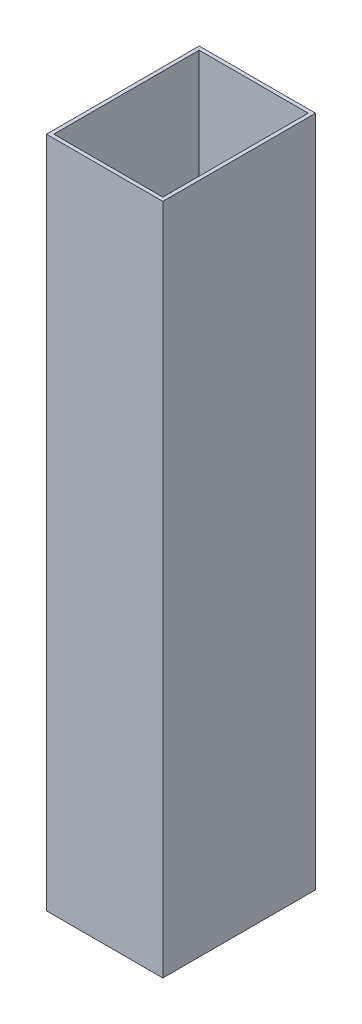
ISO-10303-21;
HEADER;
FILE_DESCRIPTION(('STEP AP214'),'2;1');
FILE_NAME('part.step','',(''),(''),'','','');
FILE_SCHEMA(('AUTOMOTIVE_DESIGN { 1 0 10303 214 1 1 1 1 }'));
ENDSEC;
DATA;
#1=APPLICATION_CONTEXT('core data for automotive mechanical design processes');
#2=APPLICATION_PROTOCOL_DEFINITION('international standard','automotive_design',2000,#1);
#3=PRODUCT_CONTEXT('',#1,'mechanical');
#4=PRODUCT('Part','Part','',(#3));
#5=PRODUCT_RELATED_PRODUCT_CATEGORY('part','',(#4));
#6=PRODUCT_DEFINITION_FORMATION('','',#4);
#7=PRODUCT_DEFINITION_CONTEXT('part definition',#1,'design');
#8=PRODUCT_DEFINITION('design','',#6,#7);
#9=PRODUCT_DEFINITION_SHAPE('','',#8);
#10=(LENGTH_UNIT() NAMED_UNIT(*) SI_UNIT(.MILLI.,.METRE.));
#11=(NAMED_UNIT(*) PLANE_ANGLE_UNIT() SI_UNIT($,.RADIAN.));
#12=(NAMED_UNIT(*) SI_UNIT($,.STERADIAN.) SOLID_ANGLE_UNIT());
#13=UNCERTAINTY_MEASURE_WITH_UNIT(LENGTH_MEASURE(1.E-05),#10,'distance_accuracy_value','');
#14=(GEOMETRIC_REPRESENTATION_CONTEXT(3) GLOBAL_UNCERTAINTY_ASSIGNED_CONTEXT((#13)) GLOBAL_UNIT_ASSIGNED_CONTEXT((#10,
#11,#12)) REPRESENTATION_CONTEXT('',''));
#15=CARTESIAN_POINT('',(0.,0.,0.));
#16=DIRECTION('',(0.,0.,1.));
#17=DIRECTION('',(1.,0.,0.));
#18=AXIS2_PLACEMENT_3D('',#15,#16,#17);
#19=CARTESIAN_POINT('',(0.,469.9,0.));
#20=DIRECTION('',(0.,1.,0.));
#21=DIRECTION('',(0.,0.,1.));
#22=AXIS2_PLACEMENT_3D('',#19,#20,#21);
#23=PLANE('',#22);
#24=DIRECTION('',(0.,0.,1.));
#25=VECTOR('',#24,1.);
#26=CARTESIAN_POINT('',(-29.9321568627451,469.9,18.9254901960784));
#27=LINE('',#26,#25);
#28=CARTESIAN_POINT('',(-29.9321568627451,469.9,16.3854901960784));
#29=VERTEX_POINT('',#28);
#30=CARTESIAN_POINT('',(-29.9321568627451,469.9,123.065490196078));
#31=VERTEX_POINT('',#30);
#32=EDGE_CURVE('E157',#29,#31,#27,.T.);
#33=ORIENTED_EDGE('',*,*,#32,.T.);
#34=DIRECTION('',(1.,0.,0.));
#35=VECTOR('',#34,1.);
#36=CARTESIAN_POINT('',(-27.3921568627451,469.9,123.065490196078));
#37=LINE('',#36,#35);
#38=CARTESIAN_POINT('',(51.3478431372549,469.9,123.065490196078));
#39=VERTEX_POINT('',#38);
#40=EDGE_CURVE('E160',#31,#39,#37,.T.);
#41=ORIENTED_EDGE('',*,*,#40,.T.);
#42=DIRECTION('',(0.,0.,-1.));
#43=VECTOR('',#42,1.);
#44=CARTESIAN_POINT('',(51.3478431372549,469.9,18.9254901960784));
#45=LINE('',#44,#43);
#46=CARTESIAN_POINT('',(51.3478431372549,469.9,16.3854901960784));
#47=VERTEX_POINT('',#46);
#48=EDGE_CURVE('E163',#39,#47,#45,.T.);
#49=ORIENTED_EDGE('',*,*,#48,.T.);
#50=DIRECTION('',(-1.,0.,0.));
#51=VECTOR('',#50,1.);
#52=CARTESIAN_POINT('',(-27.3921568627451,469.9,16.3854901960784));
#53=LINE('',#52,#51);
#54=EDGE_CURVE('E165',#47,#29,#53,.T.);
#55=ORIENTED_EDGE('',*,*,#54,.T.);
#56=EDGE_LOOP('',(#33,#41,#49,#55));
#57=FACE_BOUND('',#56,.T.);
#58=DIRECTION('',(1.,0.,0.));
#59=VECTOR('',#58,1.);
#60=CARTESIAN_POINT('',(-27.3921568627451,469.9,120.525490196078));
#61=LINE('',#60,#59);
#62=CARTESIAN_POINT('',(-27.3921568627451,469.9,120.525490196078));
#63=VERTEX_POINT('',#62);
#64=CARTESIAN_POINT('',(48.8078431372549,469.9,120.525490196078));
#65=VERTEX_POINT('',#64);
#66=EDGE_CURVE('E129',#63,#65,#61,.T.);
#67=ORIENTED_EDGE('',*,*,#66,.F.);
#68=DIRECTION('',(0.,0.,1.));
#69=VECTOR('',#68,1.);
#70=CARTESIAN_POINT('',(-27.3921568627451,469.9,18.9254901960784));
#71=LINE('',#70,#69);
#72=CARTESIAN_POINT('',(-27.3921568627451,469.9,18.9254901960784));
#73=VERTEX_POINT('',#72);
#74=EDGE_CURVE('E121',#73,#63,#71,.T.);
#75=ORIENTED_EDGE('',*,*,#74,.F.);
#76=DIRECTION('',(-1.,0.,0.));
#77=VECTOR('',#76,1.);
#78=CARTESIAN_POINT('',(-27.3921568627451,469.9,18.9254901960784));
#79=LINE('',#78,#77);
#80=CARTESIAN_POINT('',(48.8078431372549,469.9,18.9254901960784));
#81=VERTEX_POINT('',#80);
#82=EDGE_CURVE('E143',#81,#73,#79,.T.);
#83=ORIENTED_EDGE('',*,*,#82,.F.);
#84=DIRECTION('',(0.,0.,-1.));
#85=VECTOR('',#84,1.);
#86=CARTESIAN_POINT('',(48.8078431372549,469.9,18.9254901960784));
#87=LINE('',#86,#85);
#88=EDGE_CURVE('E141',#65,#81,#87,.T.);
#89=ORIENTED_EDGE('',*,*,#88,.F.);
#90=EDGE_LOOP('',(#67,#75,#83,#89));
#91=FACE_BOUND('',#90,.T.);
#92=ADVANCED_FACE('F56',(#57,#91),#23,.T.);
#93=CARTESIAN_POINT('',(0.,0.,0.));
#94=DIRECTION('',(0.,1.,0.));
#95=DIRECTION('',(0.,0.,1.));
#96=AXIS2_PLACEMENT_3D('',#93,#94,#95);
#97=PLANE('',#96);
#98=DIRECTION('',(0.,0.,1.));
#99=VECTOR('',#98,1.);
#100=CARTESIAN_POINT('',(-29.9321568627451,0.,18.9254901960784));
#101=LINE('',#100,#99);
#102=CARTESIAN_POINT('',(-29.9321568627451,0.,16.3854901960784));
#103=VERTEX_POINT('',#102);
#104=CARTESIAN_POINT('',(-29.9321568627451,0.,123.065490196078));
#105=VERTEX_POINT('',#104);
#106=EDGE_CURVE('E137',#103,#105,#101,.T.);
#107=ORIENTED_EDGE('',*,*,#106,.F.);
#108=DIRECTION('',(-1.,0.,0.));
#109=VECTOR('',#108,1.);
#110=CARTESIAN_POINT('',(-27.3921568627451,0.,16.3854901960784));
#111=LINE('',#110,#109);
#112=CARTESIAN_POINT('',(51.3478431372549,0.,16.3854901960784));
#113=VERTEX_POINT('',#112);
#114=EDGE_CURVE('E161',#113,#103,#111,.T.);
#115=ORIENTED_EDGE('',*,*,#114,.F.);
#116=DIRECTION('',(0.,0.,-1.));
#117=VECTOR('',#116,1.);
#118=CARTESIAN_POINT('',(51.3478431372549,0.,18.9254901960784));
#119=LINE('',#118,#117);
#120=CARTESIAN_POINT('',(51.3478431372549,0.,123.065490196078));
#121=VERTEX_POINT('',#120);
#122=EDGE_CURVE('E172',#121,#113,#119,.T.);
#123=ORIENTED_EDGE('',*,*,#122,.F.);
#124=DIRECTION('',(1.,0.,0.));
#125=VECTOR('',#124,1.);
#126=CARTESIAN_POINT('',(-27.3921568627451,0.,123.065490196078));
#127=LINE('',#126,#125);
#128=EDGE_CURVE('E170',#105,#121,#127,.T.);
#129=ORIENTED_EDGE('',*,*,#128,.F.);
#130=EDGE_LOOP('',(#107,#115,#123,#129));
#131=FACE_BOUND('',#130,.T.);
#132=DIRECTION('',(0.,0.,1.));
#133=VECTOR('',#132,1.);
#134=CARTESIAN_POINT('',(-27.3921568627451,0.,18.9254901960784));
#135=LINE('',#134,#133);
#136=CARTESIAN_POINT('',(-27.3921568627451,0.,18.9254901960784));
#137=VERTEX_POINT('',#136);
#138=CARTESIAN_POINT('',(-27.3921568627451,0.,120.525490196078));
#139=VERTEX_POINT('',#138);
#140=EDGE_CURVE('E79',#137,#139,#135,.T.);
#141=ORIENTED_EDGE('',*,*,#140,.T.);
#142=DIRECTION('',(1.,0.,0.));
#143=VECTOR('',#142,1.);
#144=CARTESIAN_POINT('',(-27.3921568627451,0.,120.525490196078));
#145=LINE('',#144,#143);
#146=CARTESIAN_POINT('',(48.8078431372549,0.,120.525490196078));
#147=VERTEX_POINT('',#146);
#148=EDGE_CURVE('E136',#139,#147,#145,.T.);
#149=ORIENTED_EDGE('',*,*,#148,.T.);
#150=DIRECTION('',(0.,0.,-1.));
#151=VECTOR('',#150,1.);
#152=CARTESIAN_POINT('',(48.8078431372549,0.,18.9254901960784));
#153=LINE('',#152,#151);
#154=CARTESIAN_POINT('',(48.8078431372549,0.,18.9254901960784));
#155=VERTEX_POINT('',#154);
#156=EDGE_CURVE('E149',#147,#155,#153,.T.);
#157=ORIENTED_EDGE('',*,*,#156,.T.);
#158=DIRECTION('',(-1.,0.,0.));
#159=VECTOR('',#158,1.);
#160=CARTESIAN_POINT('',(-27.3921568627451,0.,18.9254901960784));
#161=LINE('',#160,#159);
#162=EDGE_CURVE('E130',#155,#137,#161,.T.);
#163=ORIENTED_EDGE('',*,*,#162,.T.);
#164=EDGE_LOOP('',(#141,#149,#157,#163));
#165=FACE_BOUND('',#164,.T.);
#166=ADVANCED_FACE('F190',(#131,#165),#97,.F.);
#167=CARTESIAN_POINT('',(-29.9321568627451,469.9,18.9254901960784));
#168=DIRECTION('',(1.,0.,0.));
#169=DIRECTION('',(0.,0.,-1.));
#170=AXIS2_PLACEMENT_3D('',#167,#168,#169);
#171=PLANE('',#170);
#172=ORIENTED_EDGE('',*,*,#106,.T.);
#173=DIRECTION('',(0.,-1.,0.));
#174=VECTOR('',#173,1.);
#175=CARTESIAN_POINT('',(-29.9321568627451,469.9,123.065490196078));
#176=LINE('',#175,#174);
#177=EDGE_CURVE('E12',#31,#105,#176,.T.);
#178=ORIENTED_EDGE('',*,*,#177,.F.);
#179=ORIENTED_EDGE('',*,*,#32,.F.);
#180=DIRECTION('',(0.,-1.,0.));
#181=VECTOR('',#180,1.);
#182=CARTESIAN_POINT('',(-29.9321568627451,469.9,16.3854901960784));
#183=LINE('',#182,#181);
#184=EDGE_CURVE('E167',#29,#103,#183,.T.);
#185=ORIENTED_EDGE('',*,*,#184,.T.);
#186=EDGE_LOOP('',(#172,#178,#179,#185));
#187=FACE_BOUND('',#186,.T.);
#188=ADVANCED_FACE('F58',(#187),#171,.F.);
#189=CARTESIAN_POINT('',(-27.3921568627451,469.9,123.065490196078));
#190=DIRECTION('',(0.,0.,-1.));
#191=DIRECTION('',(-1.,0.,0.));
#192=AXIS2_PLACEMENT_3D('',#189,#190,#191);
#193=PLANE('',#192);
#194=ORIENTED_EDGE('',*,*,#128,.T.);
#195=DIRECTION('',(0.,-1.,0.));
#196=VECTOR('',#195,1.);
#197=CARTESIAN_POINT('',(51.3478431372549,469.9,123.065490196078));
#198=LINE('',#197,#196);
#199=EDGE_CURVE('E64',#39,#121,#198,.T.);
#200=ORIENTED_EDGE('',*,*,#199,.F.);
#201=ORIENTED_EDGE('',*,*,#40,.F.);
#202=ORIENTED_EDGE('',*,*,#177,.T.);
#203=EDGE_LOOP('',(#194,#200,#201,#202));
#204=FACE_BOUND('',#203,.T.);
#205=ADVANCED_FACE('F200',(#204),#193,.F.);
#206=CARTESIAN_POINT('',(51.3478431372549,469.9,18.9254901960784));
#207=DIRECTION('',(-1.,0.,0.));
#208=DIRECTION('',(0.,0.,1.));
#209=AXIS2_PLACEMENT_3D('',#206,#207,#208);
#210=PLANE('',#209);
#211=ORIENTED_EDGE('',*,*,#122,.T.);
#212=DIRECTION('',(0.,-1.,0.));
#213=VECTOR('',#212,1.);
#214=CARTESIAN_POINT('',(51.3478431372549,469.9,16.3854901960784));
#215=LINE('',#214,#213);
#216=EDGE_CURVE('E177',#47,#113,#215,.T.);
#217=ORIENTED_EDGE('',*,*,#216,.F.);
#218=ORIENTED_EDGE('',*,*,#48,.F.);
#219=ORIENTED_EDGE('',*,*,#199,.T.);
#220=EDGE_LOOP('',(#211,#217,#218,#219));
#221=FACE_BOUND('',#220,.T.);
#222=ADVANCED_FACE('F184',(#221),#210,.F.);
#223=CARTESIAN_POINT('',(-27.3921568627451,469.9,16.3854901960784));
#224=DIRECTION('',(0.,0.,1.));
#225=DIRECTION('',(1.,0.,0.));
#226=AXIS2_PLACEMENT_3D('',#223,#224,#225);
#227=PLANE('',#226);
#228=ORIENTED_EDGE('',*,*,#114,.T.);
#229=ORIENTED_EDGE('',*,*,#184,.F.);
#230=ORIENTED_EDGE('',*,*,#54,.F.);
#231=ORIENTED_EDGE('',*,*,#216,.T.);
#232=EDGE_LOOP('',(#228,#229,#230,#231));
#233=FACE_BOUND('',#232,.T.);
#234=ADVANCED_FACE('F194',(#233),#227,.F.);
#235=CARTESIAN_POINT('',(-27.3921568627451,469.9,18.9254901960784));
#236=DIRECTION('',(1.,0.,0.));
#237=DIRECTION('',(0.,0.,-1.));
#238=AXIS2_PLACEMENT_3D('',#235,#236,#237);
#239=PLANE('',#238);
#240=ORIENTED_EDGE('',*,*,#140,.F.);
#241=DIRECTION('',(0.,-1.,0.));
#242=VECTOR('',#241,1.);
#243=CARTESIAN_POINT('',(-27.3921568627451,469.9,18.9254901960784));
#244=LINE('',#243,#242);
#245=EDGE_CURVE('E125',#73,#137,#244,.T.);
#246=ORIENTED_EDGE('',*,*,#245,.F.);
#247=ORIENTED_EDGE('',*,*,#74,.T.);
#248=DIRECTION('',(0.,-1.,0.));
#249=VECTOR('',#248,1.);
#250=CARTESIAN_POINT('',(-27.3921568627451,469.9,120.525490196078));
#251=LINE('',#250,#249);
#252=EDGE_CURVE('E124',#63,#139,#251,.T.);
#253=ORIENTED_EDGE('',*,*,#252,.T.);
#254=EDGE_LOOP('',(#240,#246,#247,#253));
#255=FACE_BOUND('',#254,.T.);
#256=ADVANCED_FACE('F123',(#255),#239,.T.);
#257=CARTESIAN_POINT('',(-27.3921568627451,469.9,120.525490196078));
#258=DIRECTION('',(0.,0.,-1.));
#259=DIRECTION('',(-1.,0.,0.));
#260=AXIS2_PLACEMENT_3D('',#257,#258,#259);
#261=PLANE('',#260);
#262=ORIENTED_EDGE('',*,*,#148,.F.);
#263=ORIENTED_EDGE('',*,*,#252,.F.);
#264=ORIENTED_EDGE('',*,*,#66,.T.);
#265=DIRECTION('',(0.,-1.,0.));
#266=VECTOR('',#265,1.);
#267=CARTESIAN_POINT('',(48.8078431372549,469.9,120.525490196078));
#268=LINE('',#267,#266);
#269=EDGE_CURVE('E138',#65,#147,#268,.T.);
#270=ORIENTED_EDGE('',*,*,#269,.T.);
#271=EDGE_LOOP('',(#262,#263,#264,#270));
#272=FACE_BOUND('',#271,.T.);
#273=ADVANCED_FACE('F133',(#272),#261,.T.);
#274=CARTESIAN_POINT('',(48.8078431372549,469.9,18.9254901960784));
#275=DIRECTION('',(-1.,0.,0.));
#276=DIRECTION('',(0.,0.,1.));
#277=AXIS2_PLACEMENT_3D('',#274,#275,#276);
#278=PLANE('',#277);
#279=ORIENTED_EDGE('',*,*,#156,.F.);
#280=ORIENTED_EDGE('',*,*,#269,.F.);
#281=ORIENTED_EDGE('',*,*,#88,.T.);
#282=DIRECTION('',(0.,-1.,0.));
#283=VECTOR('',#282,1.);
#284=CARTESIAN_POINT('',(48.8078431372549,469.9,18.9254901960784));
#285=LINE('',#284,#283);
#286=EDGE_CURVE('E71',#81,#155,#285,.T.);
#287=ORIENTED_EDGE('',*,*,#286,.T.);
#288=EDGE_LOOP('',(#279,#280,#281,#287));
#289=FACE_BOUND('',#288,.T.);
#290=ADVANCED_FACE('F223',(#289),#278,.T.);
#291=CARTESIAN_POINT('',(-27.3921568627451,469.9,18.9254901960784));
#292=DIRECTION('',(0.,0.,1.));
#293=DIRECTION('',(1.,0.,0.));
#294=AXIS2_PLACEMENT_3D('',#291,#292,#293);
#295=PLANE('',#294);
#296=ORIENTED_EDGE('',*,*,#162,.F.);
#297=ORIENTED_EDGE('',*,*,#286,.F.);
#298=ORIENTED_EDGE('',*,*,#82,.T.);
#299=ORIENTED_EDGE('',*,*,#245,.T.);
#300=EDGE_LOOP('',(#296,#297,#298,#299));
#301=FACE_BOUND('',#300,.T.);
#302=ADVANCED_FACE('F227',(#301),#295,.T.);
#303=CLOSED_SHELL('',(#92,#166,#188,#205,#222,#234,#256,#273,#290,#302));
#304=MANIFOLD_SOLID_BREP('B2',#303);
#305=ADVANCED_BREP_SHAPE_REPRESENTATION('',(#18,#304),#14);
#306=SHAPE_DEFINITION_REPRESENTATION(#9,#305);
ENDSEC;
END-ISO-10303-21;
